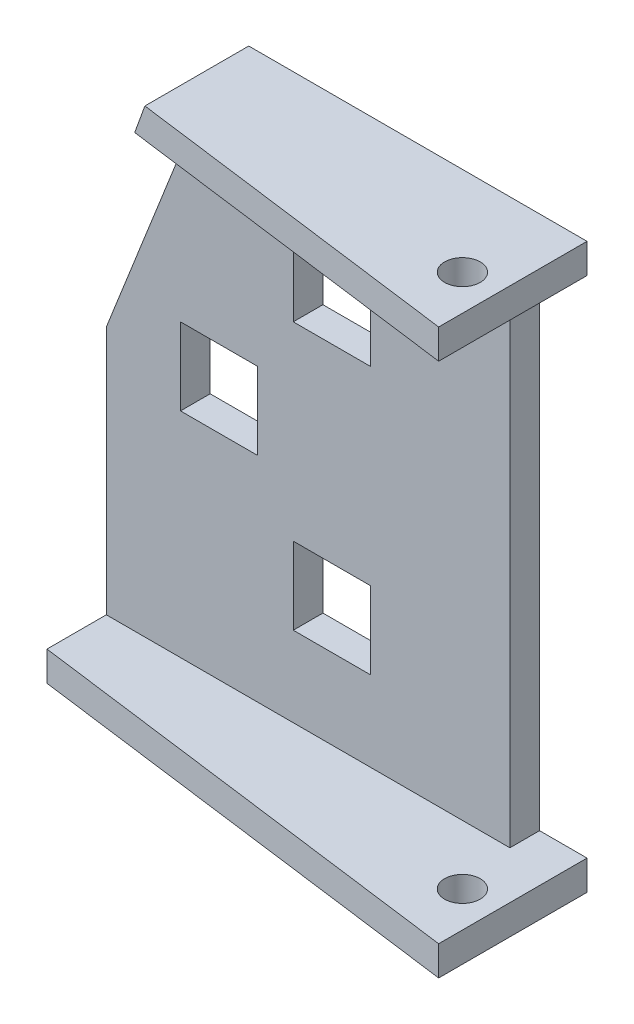
ISO-10303-21;
HEADER;
FILE_DESCRIPTION(('STEP AP214'),'2;1');
FILE_NAME('part.step','',(''),(''),'','','');
FILE_SCHEMA(('AUTOMOTIVE_DESIGN { 1 0 10303 214 1 1 1 1 }'));
ENDSEC;
DATA;
#1=APPLICATION_CONTEXT('core data for automotive mechanical design processes');
#2=APPLICATION_PROTOCOL_DEFINITION('international standard','automotive_design',2000,#1);
#3=PRODUCT_CONTEXT('',#1,'mechanical');
#4=PRODUCT('Part','Part','',(#3));
#5=PRODUCT_RELATED_PRODUCT_CATEGORY('part','',(#4));
#6=PRODUCT_DEFINITION_FORMATION('','',#4);
#7=PRODUCT_DEFINITION_CONTEXT('part definition',#1,'design');
#8=PRODUCT_DEFINITION('design','',#6,#7);
#9=PRODUCT_DEFINITION_SHAPE('','',#8);
#10=(LENGTH_UNIT() NAMED_UNIT(*) SI_UNIT(.MILLI.,.METRE.));
#11=(NAMED_UNIT(*) PLANE_ANGLE_UNIT() SI_UNIT($,.RADIAN.));
#12=(NAMED_UNIT(*) SI_UNIT($,.STERADIAN.) SOLID_ANGLE_UNIT());
#13=UNCERTAINTY_MEASURE_WITH_UNIT(LENGTH_MEASURE(1.E-05),#10,'distance_accuracy_value','');
#14=(GEOMETRIC_REPRESENTATION_CONTEXT(3) GLOBAL_UNCERTAINTY_ASSIGNED_CONTEXT((#13)) GLOBAL_UNIT_ASSIGNED_CONTEXT((#10,
#11,#12)) REPRESENTATION_CONTEXT('',''));
#15=CARTESIAN_POINT('',(0.,0.,0.));
#16=DIRECTION('',(0.,0.,1.));
#17=DIRECTION('',(1.,0.,0.));
#18=AXIS2_PLACEMENT_3D('',#15,#16,#17);
#19=CARTESIAN_POINT('',(5.99999999999999,0.,5.));
#20=DIRECTION('',(-1.,0.,0.));
#21=DIRECTION('',(0.,0.,1.));
#22=AXIS2_PLACEMENT_3D('',#19,#20,#21);
#23=PLANE('',#22);
#24=DIRECTION('',(0.,1.,0.));
#25=VECTOR('',#24,1.);
#26=CARTESIAN_POINT('',(5.99999999999999,0.,0.));
#27=LINE('',#26,#25);
#28=CARTESIAN_POINT('',(5.99999999999999,0.,0.));
#29=VERTEX_POINT('',#28);
#30=CARTESIAN_POINT('',(5.99999999999999,5.,0.));
#31=VERTEX_POINT('',#30);
#32=EDGE_CURVE('E228',#29,#31,#27,.T.);
#33=ORIENTED_EDGE('',*,*,#32,.T.);
#34=DIRECTION('',(0.,0.,-1.));
#35=VECTOR('',#34,1.);
#36=CARTESIAN_POINT('',(5.99999999999999,5.00000000000001,25.));
#37=LINE('',#36,#35);
#38=CARTESIAN_POINT('',(5.99999999999999,5.,25.));
#39=VERTEX_POINT('',#38);
#40=EDGE_CURVE('E317',#39,#31,#37,.T.);
#41=ORIENTED_EDGE('',*,*,#40,.F.);
#42=DIRECTION('',(0.,1.,0.));
#43=VECTOR('',#42,1.);
#44=CARTESIAN_POINT('',(5.99999999999999,0.,25.));
#45=LINE('',#44,#43);
#46=CARTESIAN_POINT('',(5.99999999999999,0.,25.));
#47=VERTEX_POINT('',#46);
#48=EDGE_CURVE('E262',#47,#39,#45,.T.);
#49=ORIENTED_EDGE('',*,*,#48,.F.);
#50=DIRECTION('',(0.,0.,-1.));
#51=VECTOR('',#50,1.);
#52=CARTESIAN_POINT('',(5.99999999999999,0.,5.));
#53=LINE('',#52,#51);
#54=EDGE_CURVE('E54',#47,#29,#53,.T.);
#55=ORIENTED_EDGE('',*,*,#54,.T.);
#56=EDGE_LOOP('',(#33,#41,#49,#55));
#57=FACE_BOUND('',#56,.T.);
#58=ADVANCED_FACE('F44',(#57),#23,.F.);
#59=CARTESIAN_POINT('',(0.,0.,5.));
#60=DIRECTION('',(0.,0.,1.));
#61=DIRECTION('',(1.,0.,0.));
#62=AXIS2_PLACEMENT_3D('',#59,#60,#61);
#63=PLANE('',#62);
#64=DIRECTION('',(0.,-1.,0.));
#65=VECTOR('',#64,1.);
#66=CARTESIAN_POINT('',(-2.00000000000001,90.,5.));
#67=LINE('',#66,#65);
#68=CARTESIAN_POINT('',(-2.00000000000001,90.,5.));
#69=VERTEX_POINT('',#68);
#70=CARTESIAN_POINT('',(-2.00000000000001,5.00000000000001,5.));
#71=VERTEX_POINT('',#70);
#72=EDGE_CURVE('E61',#69,#71,#67,.T.);
#73=ORIENTED_EDGE('',*,*,#72,.F.);
#74=DIRECTION('',(1.,0.,0.));
#75=VECTOR('',#74,1.);
#76=CARTESIAN_POINT('',(-52.9791666666667,90.,5.));
#77=LINE('',#76,#75);
#78=CARTESIAN_POINT('',(-52.9791666666667,90.,5.));
#79=VERTEX_POINT('',#78);
#80=EDGE_CURVE('E327',#79,#69,#77,.T.);
#81=ORIENTED_EDGE('',*,*,#80,.F.);
#82=DIRECTION('',(-0.368048451007378,-0.929806613071272,0.));
#83=VECTOR('',#82,1.);
#84=CARTESIAN_POINT('',(-51.,95.,5.));
#85=LINE('',#84,#83);
#86=CARTESIAN_POINT('',(-70.,47.,5.));
#87=VERTEX_POINT('',#86);
#88=EDGE_CURVE('E249',#79,#87,#85,.T.);
#89=ORIENTED_EDGE('',*,*,#88,.T.);
#90=DIRECTION('',(0.,-1.,0.));
#91=VECTOR('',#90,1.);
#92=CARTESIAN_POINT('',(-70.,47.,5.));
#93=LINE('',#92,#91);
#94=CARTESIAN_POINT('',(-70.,5.,5.));
#95=VERTEX_POINT('',#94);
#96=EDGE_CURVE('E243',#87,#95,#93,.T.);
#97=ORIENTED_EDGE('',*,*,#96,.T.);
#98=DIRECTION('',(-1.,0.,0.));
#99=VECTOR('',#98,1.);
#100=CARTESIAN_POINT('',(5.99999999999999,5.00000000000001,5.));
#101=LINE('',#100,#99);
#102=EDGE_CURVE('E324',#71,#95,#101,.T.);
#103=ORIENTED_EDGE('',*,*,#102,.F.);
#104=EDGE_LOOP('',(#73,#81,#89,#97,#103));
#105=FACE_BOUND('',#104,.T.);
#106=DIRECTION('',(0.,-1.,0.));
#107=VECTOR('',#106,1.);
#108=CARTESIAN_POINT('',(-38.5000000000001,76.5,5.));
#109=LINE('',#108,#107);
#110=CARTESIAN_POINT('',(-38.5000000000001,76.5,5.));
#111=VERTEX_POINT('',#110);
#112=CARTESIAN_POINT('',(-38.5,63.5,5.));
#113=VERTEX_POINT('',#112);
#114=EDGE_CURVE('E355',#111,#113,#109,.T.);
#115=ORIENTED_EDGE('',*,*,#114,.F.);
#116=DIRECTION('',(-1.,0.,0.));
#117=VECTOR('',#116,1.);
#118=CARTESIAN_POINT('',(-38.5000000000001,76.5,5.));
#119=LINE('',#118,#117);
#120=CARTESIAN_POINT('',(-25.5000000000001,76.5,5.));
#121=VERTEX_POINT('',#120);
#122=EDGE_CURVE('E342',#121,#111,#119,.T.);
#123=ORIENTED_EDGE('',*,*,#122,.F.);
#124=DIRECTION('',(0.,1.,0.));
#125=VECTOR('',#124,1.);
#126=CARTESIAN_POINT('',(-25.5000000000001,76.5,5.));
#127=LINE('',#126,#125);
#128=CARTESIAN_POINT('',(-25.5000000000001,63.5,5.));
#129=VERTEX_POINT('',#128);
#130=EDGE_CURVE('E363',#129,#121,#127,.T.);
#131=ORIENTED_EDGE('',*,*,#130,.F.);
#132=DIRECTION('',(1.,0.,0.));
#133=VECTOR('',#132,1.);
#134=CARTESIAN_POINT('',(-38.5,63.5,5.));
#135=LINE('',#134,#133);
#136=EDGE_CURVE('E358',#113,#129,#135,.T.);
#137=ORIENTED_EDGE('',*,*,#136,.F.);
#138=EDGE_LOOP('',(#115,#123,#131,#137));
#139=FACE_BOUND('',#138,.T.);
#140=DIRECTION('',(0.,-1.,0.));
#141=VECTOR('',#140,1.);
#142=CARTESIAN_POINT('',(-38.5,31.5,5.));
#143=LINE('',#142,#141);
#144=CARTESIAN_POINT('',(-38.5,31.5,5.));
#145=VERTEX_POINT('',#144);
#146=CARTESIAN_POINT('',(-38.5,18.5,5.));
#147=VERTEX_POINT('',#146);
#148=EDGE_CURVE('E359',#145,#147,#143,.T.);
#149=ORIENTED_EDGE('',*,*,#148,.F.);
#150=DIRECTION('',(-1.,0.,0.));
#151=VECTOR('',#150,1.);
#152=CARTESIAN_POINT('',(-38.5,31.5,5.));
#153=LINE('',#152,#151);
#154=CARTESIAN_POINT('',(-25.5,31.5,5.));
#155=VERTEX_POINT('',#154);
#156=EDGE_CURVE('E397',#155,#145,#153,.T.);
#157=ORIENTED_EDGE('',*,*,#156,.F.);
#158=DIRECTION('',(0.,1.,0.));
#159=VECTOR('',#158,1.);
#160=CARTESIAN_POINT('',(-25.5,31.5,5.));
#161=LINE('',#160,#159);
#162=CARTESIAN_POINT('',(-25.5,18.5,5.));
#163=VERTEX_POINT('',#162);
#164=EDGE_CURVE('E401',#163,#155,#161,.T.);
#165=ORIENTED_EDGE('',*,*,#164,.F.);
#166=DIRECTION('',(1.,0.,0.));
#167=VECTOR('',#166,1.);
#168=CARTESIAN_POINT('',(-38.5,18.5,5.));
#169=LINE('',#168,#167);
#170=EDGE_CURVE('E406',#147,#163,#169,.T.);
#171=ORIENTED_EDGE('',*,*,#170,.F.);
#172=EDGE_LOOP('',(#149,#157,#165,#171));
#173=FACE_BOUND('',#172,.T.);
#174=DIRECTION('',(0.,-1.,0.));
#175=VECTOR('',#174,1.);
#176=CARTESIAN_POINT('',(-57.5,54.,5.));
#177=LINE('',#176,#175);
#178=CARTESIAN_POINT('',(-57.5,54.,5.));
#179=VERTEX_POINT('',#178);
#180=CARTESIAN_POINT('',(-57.5,41.,5.));
#181=VERTEX_POINT('',#180);
#182=EDGE_CURVE('E396',#179,#181,#177,.T.);
#183=ORIENTED_EDGE('',*,*,#182,.F.);
#184=DIRECTION('',(-1.,0.,0.));
#185=VECTOR('',#184,1.);
#186=CARTESIAN_POINT('',(-57.5,54.,5.));
#187=LINE('',#186,#185);
#188=CARTESIAN_POINT('',(-44.5,54.,5.));
#189=VERTEX_POINT('',#188);
#190=EDGE_CURVE('E439',#189,#179,#187,.T.);
#191=ORIENTED_EDGE('',*,*,#190,.F.);
#192=DIRECTION('',(0.,1.,0.));
#193=VECTOR('',#192,1.);
#194=CARTESIAN_POINT('',(-44.5,54.,5.));
#195=LINE('',#194,#193);
#196=CARTESIAN_POINT('',(-44.5,41.,5.));
#197=VERTEX_POINT('',#196);
#198=EDGE_CURVE('E443',#197,#189,#195,.T.);
#199=ORIENTED_EDGE('',*,*,#198,.F.);
#200=DIRECTION('',(1.,0.,0.));
#201=VECTOR('',#200,1.);
#202=CARTESIAN_POINT('',(-57.5,41.,5.));
#203=LINE('',#202,#201);
#204=EDGE_CURVE('E448',#181,#197,#203,.T.);
#205=ORIENTED_EDGE('',*,*,#204,.F.);
#206=EDGE_LOOP('',(#183,#191,#199,#205));
#207=FACE_BOUND('',#206,.T.);
#208=ADVANCED_FACE('F487',(#105,#139,#173,#207),#63,.T.);
#209=CARTESIAN_POINT('',(-70.,47.,5.));
#210=DIRECTION('',(1.,0.,0.));
#211=DIRECTION('',(0.,0.,-1.));
#212=AXIS2_PLACEMENT_3D('',#209,#210,#211);
#213=PLANE('',#212);
#214=DIRECTION('',(0.,0.,-1.));
#215=VECTOR('',#214,1.);
#216=CARTESIAN_POINT('',(-70.,0.,5.));
#217=LINE('',#216,#215);
#218=CARTESIAN_POINT('',(-70.,0.,15.));
#219=VERTEX_POINT('',#218);
#220=CARTESIAN_POINT('',(-70.,0.,0.));
#221=VERTEX_POINT('',#220);
#222=EDGE_CURVE('E11',#219,#221,#217,.T.);
#223=ORIENTED_EDGE('',*,*,#222,.F.);
#224=DIRECTION('',(0.,-1.,0.));
#225=VECTOR('',#224,1.);
#226=CARTESIAN_POINT('',(-70.,95.,15.));
#227=LINE('',#226,#225);
#228=CARTESIAN_POINT('',(-70.,5.,15.));
#229=VERTEX_POINT('',#228);
#230=EDGE_CURVE('E301',#229,#219,#227,.T.);
#231=ORIENTED_EDGE('',*,*,#230,.F.);
#232=DIRECTION('',(0.,0.,-1.));
#233=VECTOR('',#232,1.);
#234=CARTESIAN_POINT('',(-70.,5.,25.));
#235=LINE('',#234,#233);
#236=EDGE_CURVE('E320',#229,#95,#235,.T.);
#237=ORIENTED_EDGE('',*,*,#236,.T.);
#238=ORIENTED_EDGE('',*,*,#96,.F.);
#239=DIRECTION('',(0.,0.,-1.));
#240=VECTOR('',#239,1.);
#241=CARTESIAN_POINT('',(-70.,47.,5.));
#242=LINE('',#241,#240);
#243=CARTESIAN_POINT('',(-70.,47.,0.));
#244=VERTEX_POINT('',#243);
#245=EDGE_CURVE('E244',#87,#244,#242,.T.);
#246=ORIENTED_EDGE('',*,*,#245,.T.);
#247=DIRECTION('',(0.,-1.,0.));
#248=VECTOR('',#247,1.);
#249=CARTESIAN_POINT('',(-70.,47.,0.));
#250=LINE('',#249,#248);
#251=EDGE_CURVE('E234',#244,#221,#250,.T.);
#252=ORIENTED_EDGE('',*,*,#251,.T.);
#253=EDGE_LOOP('',(#223,#231,#237,#238,#246,#252));
#254=FACE_BOUND('',#253,.T.);
#255=ADVANCED_FACE('F46',(#254),#213,.F.);
#256=CARTESIAN_POINT('',(-70.,0.,5.));
#257=DIRECTION('',(0.,1.,0.));
#258=DIRECTION('',(0.,0.,1.));
#259=AXIS2_PLACEMENT_3D('',#256,#257,#258);
#260=PLANE('',#259);
#261=CARTESIAN_POINT('',(0.,0.,15.));
#262=DIRECTION('',(0.,1.,0.));
#263=DIRECTION('',(-1.,0.,0.));
#264=AXIS2_PLACEMENT_3D('',#261,#262,#263);
#265=CIRCLE('',#264,3.);
#266=CARTESIAN_POINT('',(-3.00000000000001,0.,15.));
#267=VERTEX_POINT('',#266);
#268=EDGE_CURVE('E285',#267,#267,#265,.T.);
#269=ORIENTED_EDGE('',*,*,#268,.T.);
#270=EDGE_LOOP('',(#269));
#271=FACE_BOUND('',#270,.T.);
#272=ORIENTED_EDGE('',*,*,#54,.F.);
#273=DIRECTION('',(0.991454295542544,0.,0.130454512571387));
#274=VECTOR('',#273,1.);
#275=CARTESIAN_POINT('',(5.99999999999999,0.,25.));
#276=LINE('',#275,#274);
#277=EDGE_CURVE('E296',#219,#47,#276,.T.);
#278=ORIENTED_EDGE('',*,*,#277,.F.);
#279=ORIENTED_EDGE('',*,*,#222,.T.);
#280=DIRECTION('',(1.,0.,0.));
#281=VECTOR('',#280,1.);
#282=CARTESIAN_POINT('',(-70.,0.,0.));
#283=LINE('',#282,#281);
#284=EDGE_CURVE('E229',#221,#29,#283,.T.);
#285=ORIENTED_EDGE('',*,*,#284,.T.);
#286=EDGE_LOOP('',(#272,#278,#279,#285));
#287=FACE_BOUND('',#286,.T.);
#288=ADVANCED_FACE('F494',(#271,#287),#260,.F.);
#289=DIRECTION('',(0.,0.,-1.));
#290=VECTOR('',#289,1.);
#291=CARTESIAN_POINT('',(5.99999999999999,90.,25.));
#292=LINE('',#291,#290);
#293=CARTESIAN_POINT('',(5.99999999999999,90.,25.));
#294=VERTEX_POINT('',#293);
#295=CARTESIAN_POINT('',(5.99999999999999,90.,0.));
#296=VERTEX_POINT('',#295);
#297=EDGE_CURVE('E202',#294,#296,#292,.T.);
#298=ORIENTED_EDGE('',*,*,#297,.T.);
#299=CARTESIAN_POINT('',(5.99999999999999,95.,0.));
#300=VERTEX_POINT('',#299);
#301=EDGE_CURVE('E207',#296,#300,#27,.T.);
#302=ORIENTED_EDGE('',*,*,#301,.T.);
#303=DIRECTION('',(0.,0.,-1.));
#304=VECTOR('',#303,1.);
#305=CARTESIAN_POINT('',(5.99999999999999,95.,5.));
#306=LINE('',#305,#304);
#307=CARTESIAN_POINT('',(5.99999999999999,95.,25.));
#308=VERTEX_POINT('',#307);
#309=EDGE_CURVE('E252',#308,#300,#306,.T.);
#310=ORIENTED_EDGE('',*,*,#309,.F.);
#311=DIRECTION('',(0.,1.,0.));
#312=VECTOR('',#311,1.);
#313=CARTESIAN_POINT('',(5.99999999999999,90.,25.));
#314=LINE('',#313,#312);
#315=EDGE_CURVE('E209',#294,#308,#314,.T.);
#316=ORIENTED_EDGE('',*,*,#315,.F.);
#317=EDGE_LOOP('',(#298,#302,#310,#316));
#318=FACE_BOUND('',#317,.T.);
#319=ADVANCED_FACE('F204',(#318),#23,.F.);
#320=CARTESIAN_POINT('',(5.99999999999999,95.,5.));
#321=DIRECTION('',(0.,-1.,0.));
#322=DIRECTION('',(1.,0.,0.));
#323=AXIS2_PLACEMENT_3D('',#320,#321,#322);
#324=PLANE('',#323);
#325=CARTESIAN_POINT('',(0.,95.,15.));
#326=DIRECTION('',(0.,1.,0.));
#327=DIRECTION('',(-1.,0.,0.));
#328=AXIS2_PLACEMENT_3D('',#325,#326,#327);
#329=CIRCLE('',#328,3.);
#330=CARTESIAN_POINT('',(-3.00000000000005,95.,15.));
#331=VERTEX_POINT('',#330);
#332=EDGE_CURVE('E283',#331,#331,#329,.T.);
#333=ORIENTED_EDGE('',*,*,#332,.F.);
#334=EDGE_LOOP('',(#333));
#335=FACE_BOUND('',#334,.T.);
#336=DIRECTION('',(0.,0.,-1.));
#337=VECTOR('',#336,1.);
#338=CARTESIAN_POINT('',(-51.,95.,5.));
#339=LINE('',#338,#337);
#340=CARTESIAN_POINT('',(-51.,95.,17.5));
#341=VERTEX_POINT('',#340);
#342=CARTESIAN_POINT('',(-51.,95.,0.));
#343=VERTEX_POINT('',#342);
#344=EDGE_CURVE('E248',#341,#343,#339,.T.);
#345=ORIENTED_EDGE('',*,*,#344,.F.);
#346=DIRECTION('',(0.991454295542544,0.,0.130454512571387));
#347=VECTOR('',#346,1.);
#348=CARTESIAN_POINT('',(5.99999999999999,95.,25.));
#349=LINE('',#348,#347);
#350=EDGE_CURVE('E297',#341,#308,#349,.T.);
#351=ORIENTED_EDGE('',*,*,#350,.T.);
#352=ORIENTED_EDGE('',*,*,#309,.T.);
#353=DIRECTION('',(-1.,0.,0.));
#354=VECTOR('',#353,1.);
#355=CARTESIAN_POINT('',(5.99999999999999,95.,0.));
#356=LINE('',#355,#354);
#357=EDGE_CURVE('E226',#300,#343,#356,.T.);
#358=ORIENTED_EDGE('',*,*,#357,.T.);
#359=EDGE_LOOP('',(#345,#351,#352,#358));
#360=FACE_BOUND('',#359,.T.);
#361=ADVANCED_FACE('F483',(#335,#360),#324,.F.);
#362=CARTESIAN_POINT('',(-51.,95.,5.));
#363=DIRECTION('',(0.929806613071272,-0.368048451007378,0.));
#364=DIRECTION('',(0.368048451007378,0.929806613071272,0.));
#365=AXIS2_PLACEMENT_3D('',#362,#363,#364);
#366=PLANE('',#365);
#367=DIRECTION('',(0.,0.,-1.));
#368=VECTOR('',#367,1.);
#369=CARTESIAN_POINT('',(-52.9791666666667,90.,25.));
#370=LINE('',#369,#368);
#371=CARTESIAN_POINT('',(-52.9791666666667,90.,17.2395833333333));
#372=VERTEX_POINT('',#371);
#373=EDGE_CURVE('E69',#372,#79,#370,.T.);
#374=ORIENTED_EDGE('',*,*,#373,.F.);
#375=DIRECTION('',(0.367617632118048,0.928718228508753,0.0483707410681642));
#376=VECTOR('',#375,1.);
#377=CARTESIAN_POINT('',(-51.2222742161909,94.438465138044,17.4707533926065));
#378=LINE('',#377,#376);
#379=EDGE_CURVE('E313',#372,#341,#378,.T.);
#380=ORIENTED_EDGE('',*,*,#379,.T.);
#381=ORIENTED_EDGE('',*,*,#344,.T.);
#382=DIRECTION('',(-0.368048451007378,-0.929806613071272,0.));
#383=VECTOR('',#382,1.);
#384=CARTESIAN_POINT('',(-51.,95.,0.));
#385=LINE('',#384,#383);
#386=EDGE_CURVE('E240',#343,#244,#385,.T.);
#387=ORIENTED_EDGE('',*,*,#386,.T.);
#388=ORIENTED_EDGE('',*,*,#245,.F.);
#389=ORIENTED_EDGE('',*,*,#88,.F.);
#390=EDGE_LOOP('',(#374,#380,#381,#387,#388,#389));
#391=FACE_BOUND('',#390,.T.);
#392=ADVANCED_FACE('F479',(#391),#366,.F.);
#393=CARTESIAN_POINT('',(0.,0.,0.));
#394=DIRECTION('',(0.,0.,1.));
#395=DIRECTION('',(1.,0.,0.));
#396=AXIS2_PLACEMENT_3D('',#393,#394,#395);
#397=PLANE('',#396);
#398=DIRECTION('',(-1.,0.,0.));
#399=VECTOR('',#398,1.);
#400=CARTESIAN_POINT('',(-38.5000000000001,76.5,0.));
#401=LINE('',#400,#399);
#402=CARTESIAN_POINT('',(-25.5000000000001,76.5,0.));
#403=VERTEX_POINT('',#402);
#404=CARTESIAN_POINT('',(-38.5000000000001,76.5,0.));
#405=VERTEX_POINT('',#404);
#406=EDGE_CURVE('E350',#403,#405,#401,.T.);
#407=ORIENTED_EDGE('',*,*,#406,.T.);
#408=DIRECTION('',(0.,-1.,0.));
#409=VECTOR('',#408,1.);
#410=CARTESIAN_POINT('',(-38.5000000000001,76.5,0.));
#411=LINE('',#410,#409);
#412=CARTESIAN_POINT('',(-38.5,63.5,0.));
#413=VERTEX_POINT('',#412);
#414=EDGE_CURVE('E337',#405,#413,#411,.T.);
#415=ORIENTED_EDGE('',*,*,#414,.T.);
#416=DIRECTION('',(1.,0.,0.));
#417=VECTOR('',#416,1.);
#418=CARTESIAN_POINT('',(-38.5,63.5,0.));
#419=LINE('',#418,#417);
#420=CARTESIAN_POINT('',(-25.5000000000001,63.5,0.));
#421=VERTEX_POINT('',#420);
#422=EDGE_CURVE('E341',#413,#421,#419,.T.);
#423=ORIENTED_EDGE('',*,*,#422,.T.);
#424=DIRECTION('',(0.,1.,0.));
#425=VECTOR('',#424,1.);
#426=CARTESIAN_POINT('',(-25.5000000000001,76.5,0.));
#427=LINE('',#426,#425);
#428=EDGE_CURVE('E346',#421,#403,#427,.T.);
#429=ORIENTED_EDGE('',*,*,#428,.T.);
#430=EDGE_LOOP('',(#407,#415,#423,#429));
#431=FACE_BOUND('',#430,.T.);
#432=DIRECTION('',(-1.,0.,0.));
#433=VECTOR('',#432,1.);
#434=CARTESIAN_POINT('',(-38.5,31.5,0.));
#435=LINE('',#434,#433);
#436=CARTESIAN_POINT('',(-25.5,31.5,0.));
#437=VERTEX_POINT('',#436);
#438=CARTESIAN_POINT('',(-38.5,31.5,0.));
#439=VERTEX_POINT('',#438);
#440=EDGE_CURVE('E386',#437,#439,#435,.T.);
#441=ORIENTED_EDGE('',*,*,#440,.T.);
#442=DIRECTION('',(0.,-1.,0.));
#443=VECTOR('',#442,1.);
#444=CARTESIAN_POINT('',(-38.5,31.5,0.));
#445=LINE('',#444,#443);
#446=CARTESIAN_POINT('',(-38.5,18.5,0.));
#447=VERTEX_POINT('',#446);
#448=EDGE_CURVE('E402',#439,#447,#445,.T.);
#449=ORIENTED_EDGE('',*,*,#448,.T.);
#450=DIRECTION('',(1.,0.,0.));
#451=VECTOR('',#450,1.);
#452=CARTESIAN_POINT('',(-38.5,18.5,0.));
#453=LINE('',#452,#451);
#454=CARTESIAN_POINT('',(-25.5,18.5,0.));
#455=VERTEX_POINT('',#454);
#456=EDGE_CURVE('E419',#447,#455,#453,.T.);
#457=ORIENTED_EDGE('',*,*,#456,.T.);
#458=DIRECTION('',(0.,1.,0.));
#459=VECTOR('',#458,1.);
#460=CARTESIAN_POINT('',(-25.5,31.5,0.));
#461=LINE('',#460,#459);
#462=EDGE_CURVE('E415',#455,#437,#461,.T.);
#463=ORIENTED_EDGE('',*,*,#462,.T.);
#464=EDGE_LOOP('',(#441,#449,#457,#463));
#465=FACE_BOUND('',#464,.T.);
#466=DIRECTION('',(-1.,0.,0.));
#467=VECTOR('',#466,1.);
#468=CARTESIAN_POINT('',(-57.5,54.,0.));
#469=LINE('',#468,#467);
#470=CARTESIAN_POINT('',(-44.5,54.,0.));
#471=VERTEX_POINT('',#470);
#472=CARTESIAN_POINT('',(-57.5,54.,0.));
#473=VERTEX_POINT('',#472);
#474=EDGE_CURVE('E430',#471,#473,#469,.T.);
#475=ORIENTED_EDGE('',*,*,#474,.T.);
#476=DIRECTION('',(0.,-1.,0.));
#477=VECTOR('',#476,1.);
#478=CARTESIAN_POINT('',(-57.5,54.,0.));
#479=LINE('',#478,#477);
#480=CARTESIAN_POINT('',(-57.5,41.,0.));
#481=VERTEX_POINT('',#480);
#482=EDGE_CURVE('E444',#473,#481,#479,.T.);
#483=ORIENTED_EDGE('',*,*,#482,.T.);
#484=DIRECTION('',(1.,0.,0.));
#485=VECTOR('',#484,1.);
#486=CARTESIAN_POINT('',(-57.5,41.,0.));
#487=LINE('',#486,#485);
#488=CARTESIAN_POINT('',(-44.5,41.,0.));
#489=VERTEX_POINT('',#488);
#490=EDGE_CURVE('E461',#481,#489,#487,.T.);
#491=ORIENTED_EDGE('',*,*,#490,.T.);
#492=DIRECTION('',(0.,1.,0.));
#493=VECTOR('',#492,1.);
#494=CARTESIAN_POINT('',(-44.5,54.,0.));
#495=LINE('',#494,#493);
#496=EDGE_CURVE('E457',#489,#471,#495,.T.);
#497=ORIENTED_EDGE('',*,*,#496,.T.);
#498=EDGE_LOOP('',(#475,#483,#491,#497));
#499=FACE_BOUND('',#498,.T.);
#500=DIRECTION('',(0.,-1.,0.));
#501=VECTOR('',#500,1.);
#502=CARTESIAN_POINT('',(-2.00000000000001,90.,0.));
#503=LINE('',#502,#501);
#504=CARTESIAN_POINT('',(-2.00000000000001,90.,0.));
#505=VERTEX_POINT('',#504);
#506=CARTESIAN_POINT('',(-2.,5.,0.));
#507=VERTEX_POINT('',#506);
#508=EDGE_CURVE('E220',#505,#507,#503,.T.);
#509=ORIENTED_EDGE('',*,*,#508,.T.);
#510=DIRECTION('',(1.,0.,0.));
#511=VECTOR('',#510,1.);
#512=CARTESIAN_POINT('',(5.99999999999999,5.,0.));
#513=LINE('',#512,#511);
#514=EDGE_CURVE('E270',#507,#31,#513,.T.);
#515=ORIENTED_EDGE('',*,*,#514,.T.);
#516=ORIENTED_EDGE('',*,*,#32,.F.);
#517=ORIENTED_EDGE('',*,*,#284,.F.);
#518=ORIENTED_EDGE('',*,*,#251,.F.);
#519=ORIENTED_EDGE('',*,*,#386,.F.);
#520=ORIENTED_EDGE('',*,*,#357,.F.);
#521=ORIENTED_EDGE('',*,*,#301,.F.);
#522=DIRECTION('',(-1.,0.,0.));
#523=VECTOR('',#522,1.);
#524=CARTESIAN_POINT('',(5.99999999999999,90.,0.));
#525=LINE('',#524,#523);
#526=EDGE_CURVE('E213',#296,#505,#525,.T.);
#527=ORIENTED_EDGE('',*,*,#526,.T.);
#528=EDGE_LOOP('',(#509,#515,#516,#517,#518,#519,#520,#521,#527));
#529=FACE_BOUND('',#528,.T.);
#530=ADVANCED_FACE('F223',(#431,#465,#499,#529),#397,.F.);
#531=CARTESIAN_POINT('',(-57.5,54.,0.));
#532=DIRECTION('',(-1.,0.,0.));
#533=DIRECTION('',(0.,0.,1.));
#534=AXIS2_PLACEMENT_3D('',#531,#532,#533);
#535=PLANE('',#534);
#536=ORIENTED_EDGE('',*,*,#182,.T.);
#537=DIRECTION('',(0.,0.,1.));
#538=VECTOR('',#537,1.);
#539=CARTESIAN_POINT('',(-57.5,41.,0.));
#540=LINE('',#539,#538);
#541=EDGE_CURVE('E426',#481,#181,#540,.T.);
#542=ORIENTED_EDGE('',*,*,#541,.F.);
#543=ORIENTED_EDGE('',*,*,#482,.F.);
#544=DIRECTION('',(0.,0.,1.));
#545=VECTOR('',#544,1.);
#546=CARTESIAN_POINT('',(-57.5,54.,0.));
#547=LINE('',#546,#545);
#548=EDGE_CURVE('E336',#473,#179,#547,.T.);
#549=ORIENTED_EDGE('',*,*,#548,.T.);
#550=EDGE_LOOP('',(#536,#542,#543,#549));
#551=FACE_BOUND('',#550,.T.);
#552=ADVANCED_FACE('F516',(#551),#535,.F.);
#553=CARTESIAN_POINT('',(-57.5,54.,0.));
#554=DIRECTION('',(0.,1.,0.));
#555=DIRECTION('',(0.,0.,1.));
#556=AXIS2_PLACEMENT_3D('',#553,#554,#555);
#557=PLANE('',#556);
#558=ORIENTED_EDGE('',*,*,#190,.T.);
#559=ORIENTED_EDGE('',*,*,#548,.F.);
#560=ORIENTED_EDGE('',*,*,#474,.F.);
#561=DIRECTION('',(0.,0.,1.));
#562=VECTOR('',#561,1.);
#563=CARTESIAN_POINT('',(-44.5,54.,0.));
#564=LINE('',#563,#562);
#565=EDGE_CURVE('E434',#471,#189,#564,.T.);
#566=ORIENTED_EDGE('',*,*,#565,.T.);
#567=EDGE_LOOP('',(#558,#559,#560,#566));
#568=FACE_BOUND('',#567,.T.);
#569=ADVANCED_FACE('F519',(#568),#557,.F.);
#570=CARTESIAN_POINT('',(-44.5,54.,0.));
#571=DIRECTION('',(1.,0.,0.));
#572=DIRECTION('',(0.,1.,0.));
#573=AXIS2_PLACEMENT_3D('',#570,#571,#572);
#574=PLANE('',#573);
#575=ORIENTED_EDGE('',*,*,#198,.T.);
#576=ORIENTED_EDGE('',*,*,#565,.F.);
#577=ORIENTED_EDGE('',*,*,#496,.F.);
#578=DIRECTION('',(0.,0.,1.));
#579=VECTOR('',#578,1.);
#580=CARTESIAN_POINT('',(-44.5,41.,0.));
#581=LINE('',#580,#579);
#582=EDGE_CURVE('E431',#489,#197,#581,.T.);
#583=ORIENTED_EDGE('',*,*,#582,.T.);
#584=EDGE_LOOP('',(#575,#576,#577,#583));
#585=FACE_BOUND('',#584,.T.);
#586=ADVANCED_FACE('F522',(#585),#574,.F.);
#587=CARTESIAN_POINT('',(-57.5,41.,0.));
#588=DIRECTION('',(0.,-1.,0.));
#589=DIRECTION('',(0.,0.,-1.));
#590=AXIS2_PLACEMENT_3D('',#587,#588,#589);
#591=PLANE('',#590);
#592=ORIENTED_EDGE('',*,*,#204,.T.);
#593=ORIENTED_EDGE('',*,*,#582,.F.);
#594=ORIENTED_EDGE('',*,*,#490,.F.);
#595=ORIENTED_EDGE('',*,*,#541,.T.);
#596=EDGE_LOOP('',(#592,#593,#594,#595));
#597=FACE_BOUND('',#596,.T.);
#598=ADVANCED_FACE('F526',(#597),#591,.F.);
#599=CARTESIAN_POINT('',(-38.5,31.5,0.));
#600=DIRECTION('',(-1.,0.,0.));
#601=DIRECTION('',(0.,-1.,0.));
#602=AXIS2_PLACEMENT_3D('',#599,#600,#601);
#603=PLANE('',#602);
#604=ORIENTED_EDGE('',*,*,#148,.T.);
#605=DIRECTION('',(0.,0.,1.));
#606=VECTOR('',#605,1.);
#607=CARTESIAN_POINT('',(-38.5,18.5,0.));
#608=LINE('',#607,#606);
#609=EDGE_CURVE('E382',#447,#147,#608,.T.);
#610=ORIENTED_EDGE('',*,*,#609,.F.);
#611=ORIENTED_EDGE('',*,*,#448,.F.);
#612=DIRECTION('',(0.,0.,1.));
#613=VECTOR('',#612,1.);
#614=CARTESIAN_POINT('',(-38.5,31.5,0.));
#615=LINE('',#614,#613);
#616=EDGE_CURVE('E393',#439,#145,#615,.T.);
#617=ORIENTED_EDGE('',*,*,#616,.T.);
#618=EDGE_LOOP('',(#604,#610,#611,#617));
#619=FACE_BOUND('',#618,.T.);
#620=ADVANCED_FACE('F530',(#619),#603,.F.);
#621=CARTESIAN_POINT('',(-38.5,31.5,0.));
#622=DIRECTION('',(0.,1.,0.));
#623=DIRECTION('',(-1.,0.,0.));
#624=AXIS2_PLACEMENT_3D('',#621,#622,#623);
#625=PLANE('',#624);
#626=ORIENTED_EDGE('',*,*,#156,.T.);
#627=ORIENTED_EDGE('',*,*,#616,.F.);
#628=ORIENTED_EDGE('',*,*,#440,.F.);
#629=DIRECTION('',(0.,0.,1.));
#630=VECTOR('',#629,1.);
#631=CARTESIAN_POINT('',(-25.5,31.5,0.));
#632=LINE('',#631,#630);
#633=EDGE_CURVE('E390',#437,#155,#632,.T.);
#634=ORIENTED_EDGE('',*,*,#633,.T.);
#635=EDGE_LOOP('',(#626,#627,#628,#634));
#636=FACE_BOUND('',#635,.T.);
#637=ADVANCED_FACE('F535',(#636),#625,.F.);
#638=CARTESIAN_POINT('',(-25.5,31.5,0.));
#639=DIRECTION('',(1.,0.,0.));
#640=DIRECTION('',(0.,1.,0.));
#641=AXIS2_PLACEMENT_3D('',#638,#639,#640);
#642=PLANE('',#641);
#643=ORIENTED_EDGE('',*,*,#164,.T.);
#644=ORIENTED_EDGE('',*,*,#633,.F.);
#645=ORIENTED_EDGE('',*,*,#462,.F.);
#646=DIRECTION('',(0.,0.,1.));
#647=VECTOR('',#646,1.);
#648=CARTESIAN_POINT('',(-25.5,18.5,0.));
#649=LINE('',#648,#647);
#650=EDGE_CURVE('E387',#455,#163,#649,.T.);
#651=ORIENTED_EDGE('',*,*,#650,.T.);
#652=EDGE_LOOP('',(#643,#644,#645,#651));
#653=FACE_BOUND('',#652,.T.);
#654=ADVANCED_FACE('F538',(#653),#642,.F.);
#655=CARTESIAN_POINT('',(-38.5,18.5,0.));
#656=DIRECTION('',(0.,-1.,0.));
#657=DIRECTION('',(0.,0.,-1.));
#658=AXIS2_PLACEMENT_3D('',#655,#656,#657);
#659=PLANE('',#658);
#660=ORIENTED_EDGE('',*,*,#170,.T.);
#661=ORIENTED_EDGE('',*,*,#650,.F.);
#662=ORIENTED_EDGE('',*,*,#456,.F.);
#663=ORIENTED_EDGE('',*,*,#609,.T.);
#664=EDGE_LOOP('',(#660,#661,#662,#663));
#665=FACE_BOUND('',#664,.T.);
#666=ADVANCED_FACE('F542',(#665),#659,.F.);
#667=CARTESIAN_POINT('',(-38.5000000000001,76.5,0.));
#668=DIRECTION('',(-1.,0.,0.));
#669=DIRECTION('',(0.,-1.,0.));
#670=AXIS2_PLACEMENT_3D('',#667,#668,#669);
#671=PLANE('',#670);
#672=ORIENTED_EDGE('',*,*,#114,.T.);
#673=DIRECTION('',(0.,0.,1.));
#674=VECTOR('',#673,1.);
#675=CARTESIAN_POINT('',(-38.5,63.5,0.));
#676=LINE('',#675,#674);
#677=EDGE_CURVE('E354',#413,#113,#676,.T.);
#678=ORIENTED_EDGE('',*,*,#677,.F.);
#679=ORIENTED_EDGE('',*,*,#414,.F.);
#680=DIRECTION('',(0.,0.,1.));
#681=VECTOR('',#680,1.);
#682=CARTESIAN_POINT('',(-38.5000000000001,76.5,0.));
#683=LINE('',#682,#681);
#684=EDGE_CURVE('E370',#405,#111,#683,.T.);
#685=ORIENTED_EDGE('',*,*,#684,.T.);
#686=EDGE_LOOP('',(#672,#678,#679,#685));
#687=FACE_BOUND('',#686,.T.);
#688=ADVANCED_FACE('F546',(#687),#671,.F.);
#689=CARTESIAN_POINT('',(-38.5000000000001,76.5,0.));
#690=DIRECTION('',(0.,1.,0.));
#691=DIRECTION('',(0.,0.,1.));
#692=AXIS2_PLACEMENT_3D('',#689,#690,#691);
#693=PLANE('',#692);
#694=ORIENTED_EDGE('',*,*,#122,.T.);
#695=ORIENTED_EDGE('',*,*,#684,.F.);
#696=ORIENTED_EDGE('',*,*,#406,.F.);
#697=DIRECTION('',(0.,0.,1.));
#698=VECTOR('',#697,1.);
#699=CARTESIAN_POINT('',(-25.5000000000001,76.5,0.));
#700=LINE('',#699,#698);
#701=EDGE_CURVE('E373',#403,#121,#700,.T.);
#702=ORIENTED_EDGE('',*,*,#701,.T.);
#703=EDGE_LOOP('',(#694,#695,#696,#702));
#704=FACE_BOUND('',#703,.T.);
#705=ADVANCED_FACE('F553',(#704),#693,.F.);
#706=CARTESIAN_POINT('',(-25.5000000000001,76.5,0.));
#707=DIRECTION('',(1.,0.,0.));
#708=DIRECTION('',(0.,1.,0.));
#709=AXIS2_PLACEMENT_3D('',#706,#707,#708);
#710=PLANE('',#709);
#711=ORIENTED_EDGE('',*,*,#130,.T.);
#712=ORIENTED_EDGE('',*,*,#701,.F.);
#713=ORIENTED_EDGE('',*,*,#428,.F.);
#714=DIRECTION('',(0.,0.,1.));
#715=VECTOR('',#714,1.);
#716=CARTESIAN_POINT('',(-25.5000000000001,63.5,0.));
#717=LINE('',#716,#715);
#718=EDGE_CURVE('E376',#421,#129,#717,.T.);
#719=ORIENTED_EDGE('',*,*,#718,.T.);
#720=EDGE_LOOP('',(#711,#712,#713,#719));
#721=FACE_BOUND('',#720,.T.);
#722=ADVANCED_FACE('F558',(#721),#710,.F.);
#723=CARTESIAN_POINT('',(-38.5,63.5,0.));
#724=DIRECTION('',(0.,-1.,0.));
#725=DIRECTION('',(1.,0.,0.));
#726=AXIS2_PLACEMENT_3D('',#723,#724,#725);
#727=PLANE('',#726);
#728=ORIENTED_EDGE('',*,*,#136,.T.);
#729=ORIENTED_EDGE('',*,*,#718,.F.);
#730=ORIENTED_EDGE('',*,*,#422,.F.);
#731=ORIENTED_EDGE('',*,*,#677,.T.);
#732=EDGE_LOOP('',(#728,#729,#730,#731));
#733=FACE_BOUND('',#732,.T.);
#734=ADVANCED_FACE('F555',(#733),#727,.F.);
#735=CARTESIAN_POINT('',(-52.9791666666667,90.,25.));
#736=DIRECTION('',(0.,1.,0.));
#737=DIRECTION('',(0.,0.,1.));
#738=AXIS2_PLACEMENT_3D('',#735,#736,#737);
#739=PLANE('',#738);
#740=CARTESIAN_POINT('',(0.,90.,15.));
#741=DIRECTION('',(0.,1.,0.));
#742=DIRECTION('',(0.,0.,1.));
#743=AXIS2_PLACEMENT_3D('',#740,#741,#742);
#744=CIRCLE('',#743,3.);
#745=CARTESIAN_POINT('',(0.,90.,18.));
#746=VERTEX_POINT('',#745);
#747=EDGE_CURVE('E292',#746,#746,#744,.T.);
#748=ORIENTED_EDGE('',*,*,#747,.T.);
#749=EDGE_LOOP('',(#748));
#750=FACE_BOUND('',#749,.T.);
#751=ORIENTED_EDGE('',*,*,#297,.F.);
#752=DIRECTION('',(-0.991454295542544,0.,-0.130454512571387));
#753=VECTOR('',#752,1.);
#754=CARTESIAN_POINT('',(-51.9754368050828,90.,17.3716530519628));
#755=LINE('',#754,#753);
#756=EDGE_CURVE('E310',#294,#372,#755,.T.);
#757=ORIENTED_EDGE('',*,*,#756,.T.);
#758=ORIENTED_EDGE('',*,*,#373,.T.);
#759=ORIENTED_EDGE('',*,*,#80,.T.);
#760=DIRECTION('',(0.,0.,1.));
#761=VECTOR('',#760,1.);
#762=CARTESIAN_POINT('',(-2.00000000000001,90.,0.));
#763=LINE('',#762,#761);
#764=EDGE_CURVE('E215',#505,#69,#763,.T.);
#765=ORIENTED_EDGE('',*,*,#764,.F.);
#766=ORIENTED_EDGE('',*,*,#526,.F.);
#767=EDGE_LOOP('',(#751,#757,#758,#759,#765,#766));
#768=FACE_BOUND('',#767,.T.);
#769=ADVANCED_FACE('F214',(#750,#768),#739,.F.);
#770=CARTESIAN_POINT('',(5.99999999999999,5.00000000000001,25.));
#771=DIRECTION('',(0.,-1.,0.));
#772=DIRECTION('',(1.,0.,0.));
#773=AXIS2_PLACEMENT_3D('',#770,#771,#772);
#774=PLANE('',#773);
#775=CARTESIAN_POINT('',(0.,5.00000000000001,15.));
#776=DIRECTION('',(0.,-1.,0.));
#777=DIRECTION('',(1.,0.,0.));
#778=AXIS2_PLACEMENT_3D('',#775,#776,#777);
#779=CIRCLE('',#778,3.);
#780=CARTESIAN_POINT('',(2.99999999999999,5.00000000000001,15.));
#781=VERTEX_POINT('',#780);
#782=EDGE_CURVE('E48',#781,#781,#779,.T.);
#783=ORIENTED_EDGE('',*,*,#782,.T.);
#784=EDGE_LOOP('',(#783));
#785=FACE_BOUND('',#784,.T.);
#786=ORIENTED_EDGE('',*,*,#236,.F.);
#787=DIRECTION('',(0.991454295542544,0.,0.130454512571387));
#788=VECTOR('',#787,1.);
#789=CARTESIAN_POINT('',(5.99999999999999,5.00000000000001,25.));
#790=LINE('',#789,#788);
#791=EDGE_CURVE('E306',#229,#39,#790,.T.);
#792=ORIENTED_EDGE('',*,*,#791,.T.);
#793=ORIENTED_EDGE('',*,*,#40,.T.);
#794=ORIENTED_EDGE('',*,*,#514,.F.);
#795=DIRECTION('',(0.,0.,1.));
#796=VECTOR('',#795,1.);
#797=CARTESIAN_POINT('',(-2.,5.,0.));
#798=LINE('',#797,#796);
#799=EDGE_CURVE('E276',#507,#71,#798,.T.);
#800=ORIENTED_EDGE('',*,*,#799,.T.);
#801=ORIENTED_EDGE('',*,*,#102,.T.);
#802=EDGE_LOOP('',(#786,#792,#793,#794,#800,#801));
#803=FACE_BOUND('',#802,.T.);
#804=ADVANCED_FACE('F491',(#785,#803),#774,.F.);
#805=CARTESIAN_POINT('',(5.99999999999999,95.,25.));
#806=DIRECTION('',(0.130454512571387,0.,-0.991454295542544));
#807=DIRECTION('',(-0.991454295542544,0.,-0.130454512571387));
#808=AXIS2_PLACEMENT_3D('',#805,#806,#807);
#809=PLANE('',#808);
#810=ORIENTED_EDGE('',*,*,#230,.T.);
#811=ORIENTED_EDGE('',*,*,#277,.T.);
#812=ORIENTED_EDGE('',*,*,#48,.T.);
#813=ORIENTED_EDGE('',*,*,#791,.F.);
#814=EDGE_LOOP('',(#810,#811,#812,#813));
#815=FACE_BOUND('',#814,.T.);
#816=ADVANCED_FACE('F493',(#815),#809,.F.);
#817=ORIENTED_EDGE('',*,*,#756,.F.);
#818=ORIENTED_EDGE('',*,*,#315,.T.);
#819=ORIENTED_EDGE('',*,*,#350,.F.);
#820=ORIENTED_EDGE('',*,*,#379,.F.);
#821=EDGE_LOOP('',(#817,#818,#819,#820));
#822=FACE_BOUND('',#821,.T.);
#823=ADVANCED_FACE('F485',(#822),#809,.F.);
#824=CARTESIAN_POINT('',(0.,0.,15.));
#825=DIRECTION('',(0.,1.,0.));
#826=DIRECTION('',(-1.,0.,0.));
#827=AXIS2_PLACEMENT_3D('',#824,#825,#826);
#828=CYLINDRICAL_SURFACE('',#827,3.);
#829=ORIENTED_EDGE('',*,*,#268,.F.);
#830=EDGE_LOOP('',(#829));
#831=FACE_BOUND('',#830,.T.);
#832=ORIENTED_EDGE('',*,*,#782,.F.);
#833=EDGE_LOOP('',(#832));
#834=FACE_BOUND('',#833,.T.);
#835=ADVANCED_FACE('F573',(#831,#834),#828,.F.);
#836=ORIENTED_EDGE('',*,*,#332,.T.);
#837=EDGE_LOOP('',(#836));
#838=FACE_BOUND('',#837,.T.);
#839=ORIENTED_EDGE('',*,*,#747,.F.);
#840=EDGE_LOOP('',(#839));
#841=FACE_BOUND('',#840,.T.);
#842=ADVANCED_FACE('F574',(#838,#841),#828,.F.);
#843=CARTESIAN_POINT('',(-2.00000000000001,90.,0.));
#844=DIRECTION('',(-1.,0.,0.));
#845=DIRECTION('',(0.,-1.,0.));
#846=AXIS2_PLACEMENT_3D('',#843,#844,#845);
#847=PLANE('',#846);
#848=ORIENTED_EDGE('',*,*,#72,.T.);
#849=ORIENTED_EDGE('',*,*,#799,.F.);
#850=ORIENTED_EDGE('',*,*,#508,.F.);
#851=ORIENTED_EDGE('',*,*,#764,.T.);
#852=EDGE_LOOP('',(#848,#849,#850,#851));
#853=FACE_BOUND('',#852,.T.);
#854=ADVANCED_FACE('F576',(#853),#847,.F.);
#855=CLOSED_SHELL('',(#58,#208,#255,#288,#319,#361,#392,#530,#552,#569,#586,#598,#620,#637,#654,
#666,#688,#705,#722,#734,#769,#804,#816,#823,#835,#842,#854));
#856=MANIFOLD_SOLID_BREP('B2',#855);
#857=ADVANCED_BREP_SHAPE_REPRESENTATION('',(#18,#856),#14);
#858=SHAPE_DEFINITION_REPRESENTATION(#9,#857);
ENDSEC;
END-ISO-10303-21;
